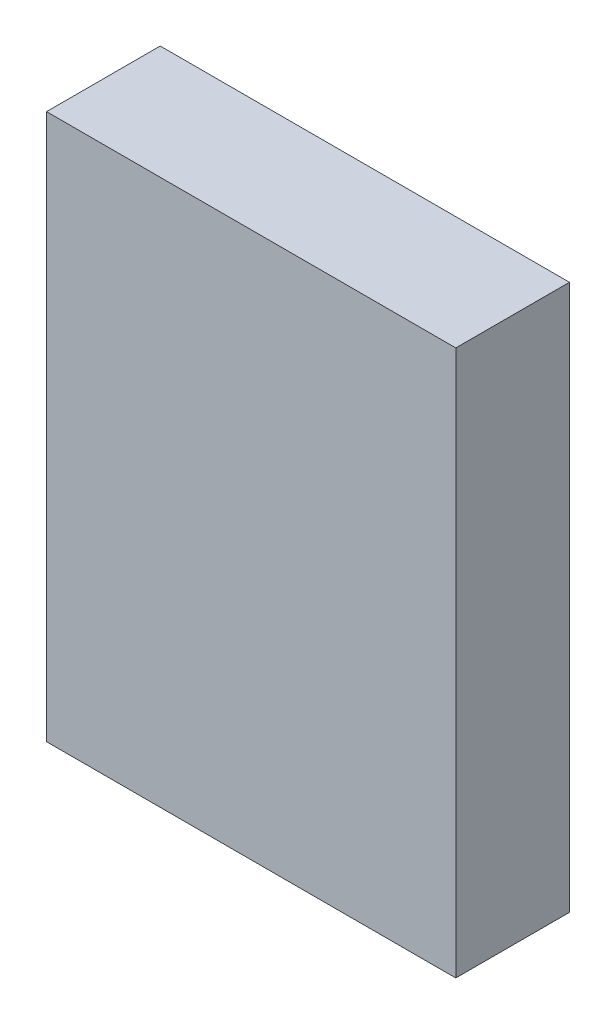
ISO-10303-21;
HEADER;
FILE_DESCRIPTION(('STEP AP214'),'2;1');
FILE_NAME('part.step','',(''),(''),'','','');
FILE_SCHEMA(('AUTOMOTIVE_DESIGN { 1 0 10303 214 1 1 1 1 }'));
ENDSEC;
DATA;
#1=APPLICATION_CONTEXT('core data for automotive mechanical design processes');
#2=APPLICATION_PROTOCOL_DEFINITION('international standard','automotive_design',2000,#1);
#3=PRODUCT_CONTEXT('',#1,'mechanical');
#4=PRODUCT('Part','Part','',(#3));
#5=PRODUCT_RELATED_PRODUCT_CATEGORY('part','',(#4));
#6=PRODUCT_DEFINITION_FORMATION('','',#4);
#7=PRODUCT_DEFINITION_CONTEXT('part definition',#1,'design');
#8=PRODUCT_DEFINITION('design','',#6,#7);
#9=PRODUCT_DEFINITION_SHAPE('','',#8);
#10=(LENGTH_UNIT() NAMED_UNIT(*) SI_UNIT(.MILLI.,.METRE.));
#11=(NAMED_UNIT(*) PLANE_ANGLE_UNIT() SI_UNIT($,.RADIAN.));
#12=(NAMED_UNIT(*) SI_UNIT($,.STERADIAN.) SOLID_ANGLE_UNIT());
#13=UNCERTAINTY_MEASURE_WITH_UNIT(LENGTH_MEASURE(1.E-05),#10,'distance_accuracy_value','');
#14=(GEOMETRIC_REPRESENTATION_CONTEXT(3) GLOBAL_UNCERTAINTY_ASSIGNED_CONTEXT((#13)) GLOBAL_UNIT_ASSIGNED_CONTEXT((#10,
#11,#12)) REPRESENTATION_CONTEXT('',''));
#15=CARTESIAN_POINT('',(0.,0.,0.));
#16=DIRECTION('',(0.,0.,1.));
#17=DIRECTION('',(1.,0.,0.));
#18=AXIS2_PLACEMENT_3D('',#15,#16,#17);
#19=CARTESIAN_POINT('',(0.,0.,0.25));
#20=DIRECTION('',(1.,0.,0.));
#21=DIRECTION('',(0.,1.,0.));
#22=AXIS2_PLACEMENT_3D('',#19,#20,#21);
#23=PLANE('',#22);
#24=DIRECTION('',(0.,-1.,0.));
#25=VECTOR('',#24,1.);
#26=CARTESIAN_POINT('',(0.,0.,0.));
#27=LINE('',#26,#25);
#28=CARTESIAN_POINT('',(0.,0.,0.));
#29=VERTEX_POINT('',#28);
#30=CARTESIAN_POINT('',(0.,-1.2,0.));
#31=VERTEX_POINT('',#30);
#32=EDGE_CURVE('E11',#29,#31,#27,.T.);
#33=ORIENTED_EDGE('',*,*,#32,.T.);
#34=DIRECTION('',(0.,0.,-1.));
#35=VECTOR('',#34,1.);
#36=CARTESIAN_POINT('',(0.,-1.2,0.25));
#37=LINE('',#36,#35);
#38=CARTESIAN_POINT('',(0.,-1.2,0.25));
#39=VERTEX_POINT('',#38);
#40=EDGE_CURVE('E24',#39,#31,#37,.T.);
#41=ORIENTED_EDGE('',*,*,#40,.F.);
#42=DIRECTION('',(0.,-1.,0.));
#43=VECTOR('',#42,1.);
#44=CARTESIAN_POINT('',(0.,0.,0.25));
#45=LINE('',#44,#43);
#46=CARTESIAN_POINT('',(0.,0.,0.25));
#47=VERTEX_POINT('',#46);
#48=EDGE_CURVE('E88',#47,#39,#45,.T.);
#49=ORIENTED_EDGE('',*,*,#48,.F.);
#50=DIRECTION('',(0.,0.,-1.));
#51=VECTOR('',#50,1.);
#52=CARTESIAN_POINT('',(0.,0.,0.25));
#53=LINE('',#52,#51);
#54=EDGE_CURVE('E77',#47,#29,#53,.T.);
#55=ORIENTED_EDGE('',*,*,#54,.T.);
#56=EDGE_LOOP('',(#33,#41,#49,#55));
#57=FACE_BOUND('',#56,.T.);
#58=ADVANCED_FACE('F17',(#57),#23,.F.);
#59=CARTESIAN_POINT('',(0.,-1.2,0.25));
#60=DIRECTION('',(0.,1.,0.));
#61=DIRECTION('',(0.,0.,1.));
#62=AXIS2_PLACEMENT_3D('',#59,#60,#61);
#63=PLANE('',#62);
#64=DIRECTION('',(1.,0.,0.));
#65=VECTOR('',#64,1.);
#66=CARTESIAN_POINT('',(0.,-1.2,0.));
#67=LINE('',#66,#65);
#68=CARTESIAN_POINT('',(0.9,-1.2,0.));
#69=VERTEX_POINT('',#68);
#70=EDGE_CURVE('E85',#31,#69,#67,.T.);
#71=ORIENTED_EDGE('',*,*,#70,.T.);
#72=DIRECTION('',(0.,0.,-1.));
#73=VECTOR('',#72,1.);
#74=CARTESIAN_POINT('',(0.9,-1.2,0.25));
#75=LINE('',#74,#73);
#76=CARTESIAN_POINT('',(0.9,-1.2,0.25));
#77=VERTEX_POINT('',#76);
#78=EDGE_CURVE('E83',#77,#69,#75,.T.);
#79=ORIENTED_EDGE('',*,*,#78,.F.);
#80=DIRECTION('',(1.,0.,0.));
#81=VECTOR('',#80,1.);
#82=CARTESIAN_POINT('',(0.,-1.2,0.25));
#83=LINE('',#82,#81);
#84=EDGE_CURVE('E72',#39,#77,#83,.T.);
#85=ORIENTED_EDGE('',*,*,#84,.F.);
#86=ORIENTED_EDGE('',*,*,#40,.T.);
#87=EDGE_LOOP('',(#71,#79,#85,#86));
#88=FACE_BOUND('',#87,.T.);
#89=ADVANCED_FACE('F90',(#88),#63,.F.);
#90=CARTESIAN_POINT('',(0.9,0.,0.25));
#91=DIRECTION('',(-1.,0.,0.));
#92=DIRECTION('',(0.,-1.,0.));
#93=AXIS2_PLACEMENT_3D('',#90,#91,#92);
#94=PLANE('',#93);
#95=DIRECTION('',(0.,1.,0.));
#96=VECTOR('',#95,1.);
#97=CARTESIAN_POINT('',(0.9,0.,0.));
#98=LINE('',#97,#96);
#99=CARTESIAN_POINT('',(0.9,0.,0.));
#100=VERTEX_POINT('',#99);
#101=EDGE_CURVE('E60',#69,#100,#98,.T.);
#102=ORIENTED_EDGE('',*,*,#101,.T.);
#103=DIRECTION('',(0.,0.,-1.));
#104=VECTOR('',#103,1.);
#105=CARTESIAN_POINT('',(0.9,0.,0.25));
#106=LINE('',#105,#104);
#107=CARTESIAN_POINT('',(0.9,0.,0.25));
#108=VERTEX_POINT('',#107);
#109=EDGE_CURVE('E54',#108,#100,#106,.T.);
#110=ORIENTED_EDGE('',*,*,#109,.F.);
#111=DIRECTION('',(0.,1.,0.));
#112=VECTOR('',#111,1.);
#113=CARTESIAN_POINT('',(0.9,0.,0.25));
#114=LINE('',#113,#112);
#115=EDGE_CURVE('E58',#77,#108,#114,.T.);
#116=ORIENTED_EDGE('',*,*,#115,.F.);
#117=ORIENTED_EDGE('',*,*,#78,.T.);
#118=EDGE_LOOP('',(#102,#110,#116,#117));
#119=FACE_BOUND('',#118,.T.);
#120=ADVANCED_FACE('F56',(#119),#94,.F.);
#121=CARTESIAN_POINT('',(0.,0.,0.25));
#122=DIRECTION('',(0.,-1.,0.));
#123=DIRECTION('',(0.,0.,-1.));
#124=AXIS2_PLACEMENT_3D('',#121,#122,#123);
#125=PLANE('',#124);
#126=DIRECTION('',(-1.,0.,0.));
#127=VECTOR('',#126,1.);
#128=CARTESIAN_POINT('',(0.,0.,0.));
#129=LINE('',#128,#127);
#130=EDGE_CURVE('E73',#100,#29,#129,.T.);
#131=ORIENTED_EDGE('',*,*,#130,.T.);
#132=ORIENTED_EDGE('',*,*,#54,.F.);
#133=DIRECTION('',(-1.,0.,0.));
#134=VECTOR('',#133,1.);
#135=CARTESIAN_POINT('',(0.,0.,0.25));
#136=LINE('',#135,#134);
#137=EDGE_CURVE('E70',#108,#47,#136,.T.);
#138=ORIENTED_EDGE('',*,*,#137,.F.);
#139=ORIENTED_EDGE('',*,*,#109,.T.);
#140=EDGE_LOOP('',(#131,#132,#138,#139));
#141=FACE_BOUND('',#140,.T.);
#142=ADVANCED_FACE('F76',(#141),#125,.F.);
#143=CARTESIAN_POINT('',(0.,-1.2,0.25));
#144=DIRECTION('',(0.,0.,1.));
#145=DIRECTION('',(1.,0.,0.));
#146=AXIS2_PLACEMENT_3D('',#143,#144,#145);
#147=PLANE('',#146);
#148=ORIENTED_EDGE('',*,*,#48,.T.);
#149=ORIENTED_EDGE('',*,*,#84,.T.);
#150=ORIENTED_EDGE('',*,*,#115,.T.);
#151=ORIENTED_EDGE('',*,*,#137,.T.);
#152=EDGE_LOOP('',(#148,#149,#150,#151));
#153=FACE_BOUND('',#152,.T.);
#154=ADVANCED_FACE('F69',(#153),#147,.T.);
#155=CARTESIAN_POINT('',(0.,-1.2,0.));
#156=DIRECTION('',(0.,0.,1.));
#157=DIRECTION('',(1.,0.,0.));
#158=AXIS2_PLACEMENT_3D('',#155,#156,#157);
#159=PLANE('',#158);
#160=ORIENTED_EDGE('',*,*,#32,.F.);
#161=ORIENTED_EDGE('',*,*,#130,.F.);
#162=ORIENTED_EDGE('',*,*,#101,.F.);
#163=ORIENTED_EDGE('',*,*,#70,.F.);
#164=EDGE_LOOP('',(#160,#161,#162,#163));
#165=FACE_BOUND('',#164,.T.);
#166=ADVANCED_FACE('F91',(#165),#159,.F.);
#167=CLOSED_SHELL('',(#58,#89,#120,#142,#154,#166));
#168=MANIFOLD_SOLID_BREP('B1',#167);
#169=ADVANCED_BREP_SHAPE_REPRESENTATION('',(#18,#168),#14);
#170=SHAPE_DEFINITION_REPRESENTATION(#9,#169);
ENDSEC;
END-ISO-10303-21;
